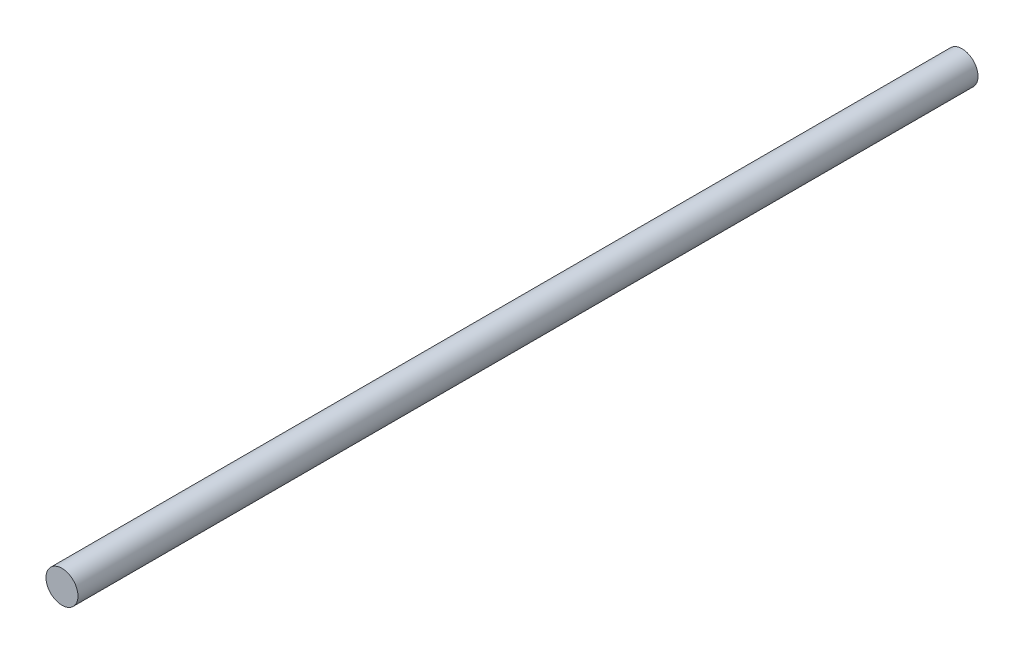
ISO-10303-21;
HEADER;
FILE_DESCRIPTION(('STEP AP214'),'2;1');
FILE_NAME('part.step','',(''),(''),'','','');
FILE_SCHEMA(('AUTOMOTIVE_DESIGN { 1 0 10303 214 1 1 1 1 }'));
ENDSEC;
DATA;
#1=APPLICATION_CONTEXT('core data for automotive mechanical design processes');
#2=APPLICATION_PROTOCOL_DEFINITION('international standard','automotive_design',2000,#1);
#3=PRODUCT_CONTEXT('',#1,'mechanical');
#4=PRODUCT('Part','Part','',(#3));
#5=PRODUCT_RELATED_PRODUCT_CATEGORY('part','',(#4));
#6=PRODUCT_DEFINITION_FORMATION('','',#4);
#7=PRODUCT_DEFINITION_CONTEXT('part definition',#1,'design');
#8=PRODUCT_DEFINITION('design','',#6,#7);
#9=PRODUCT_DEFINITION_SHAPE('','',#8);
#10=(LENGTH_UNIT() NAMED_UNIT(*) SI_UNIT(.MILLI.,.METRE.));
#11=(NAMED_UNIT(*) PLANE_ANGLE_UNIT() SI_UNIT($,.RADIAN.));
#12=(NAMED_UNIT(*) SI_UNIT($,.STERADIAN.) SOLID_ANGLE_UNIT());
#13=UNCERTAINTY_MEASURE_WITH_UNIT(LENGTH_MEASURE(1.E-05),#10,'distance_accuracy_value','');
#14=(GEOMETRIC_REPRESENTATION_CONTEXT(3) GLOBAL_UNCERTAINTY_ASSIGNED_CONTEXT((#13)) GLOBAL_UNIT_ASSIGNED_CONTEXT((#10,
#11,#12)) REPRESENTATION_CONTEXT('',''));
#15=CARTESIAN_POINT('',(0.,0.,0.));
#16=DIRECTION('',(0.,0.,1.));
#17=DIRECTION('',(1.,0.,0.));
#18=AXIS2_PLACEMENT_3D('',#15,#16,#17);
#19=CARTESIAN_POINT('',(0.,0.,112.5));
#20=DIRECTION('',(0.,0.,-1.));
#21=DIRECTION('',(-1.,0.,0.));
#22=AXIS2_PLACEMENT_3D('',#19,#20,#21);
#23=CYLINDRICAL_SURFACE('',#22,4.);
#24=CARTESIAN_POINT('',(0.,0.,112.5));
#25=DIRECTION('',(0.,0.,1.));
#26=DIRECTION('',(1.,0.,0.));
#27=AXIS2_PLACEMENT_3D('',#24,#25,#26);
#28=CIRCLE('',#27,4.);
#29=CARTESIAN_POINT('',(4.,0.,112.5));
#30=VERTEX_POINT('',#29);
#31=EDGE_CURVE('E10',#30,#30,#28,.T.);
#32=ORIENTED_EDGE('',*,*,#31,.F.);
#33=EDGE_LOOP('',(#32));
#34=FACE_BOUND('',#33,.T.);
#35=CARTESIAN_POINT('',(0.,0.,-112.5));
#36=DIRECTION('',(0.,0.,1.));
#37=DIRECTION('',(1.,0.,0.));
#38=AXIS2_PLACEMENT_3D('',#35,#36,#37);
#39=CIRCLE('',#38,4.);
#40=CARTESIAN_POINT('',(4.,0.,-112.5));
#41=VERTEX_POINT('',#40);
#42=EDGE_CURVE('E40',#41,#41,#39,.T.);
#43=ORIENTED_EDGE('',*,*,#42,.T.);
#44=EDGE_LOOP('',(#43));
#45=FACE_BOUND('',#44,.T.);
#46=ADVANCED_FACE('F37',(#34,#45),#23,.T.);
#47=CARTESIAN_POINT('',(0.,0.,112.5));
#48=DIRECTION('',(0.,0.,1.));
#49=DIRECTION('',(1.,0.,0.));
#50=AXIS2_PLACEMENT_3D('',#47,#48,#49);
#51=PLANE('',#50);
#52=ORIENTED_EDGE('',*,*,#31,.T.);
#53=EDGE_LOOP('',(#52));
#54=FACE_BOUND('',#53,.T.);
#55=ADVANCED_FACE('F54',(#54),#51,.T.);
#56=CARTESIAN_POINT('',(0.,0.,-112.5));
#57=DIRECTION('',(0.,0.,1.));
#58=DIRECTION('',(1.,0.,0.));
#59=AXIS2_PLACEMENT_3D('',#56,#57,#58);
#60=PLANE('',#59);
#61=ORIENTED_EDGE('',*,*,#42,.F.);
#62=EDGE_LOOP('',(#61));
#63=FACE_BOUND('',#62,.T.);
#64=ADVANCED_FACE('F52',(#63),#60,.F.);
#65=CLOSED_SHELL('',(#46,#55,#64));
#66=MANIFOLD_SOLID_BREP('B2',#65);
#67=ADVANCED_BREP_SHAPE_REPRESENTATION('',(#18,#66),#14);
#68=SHAPE_DEFINITION_REPRESENTATION(#9,#67);
ENDSEC;
END-ISO-10303-21;
